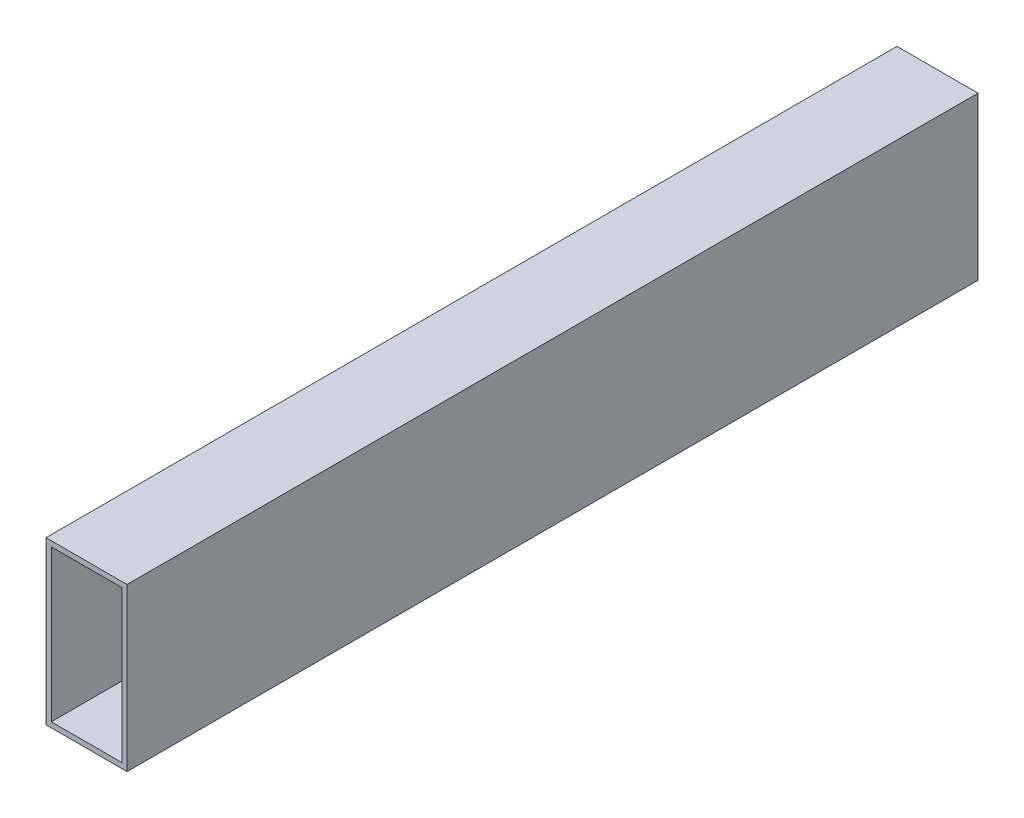
ISO-10303-21;
HEADER;
FILE_DESCRIPTION(('STEP AP214'),'2;1');
FILE_NAME('part.step','',(''),(''),'','','');
FILE_SCHEMA(('AUTOMOTIVE_DESIGN { 1 0 10303 214 1 1 1 1 }'));
ENDSEC;
DATA;
#1=APPLICATION_CONTEXT('core data for automotive mechanical design processes');
#2=APPLICATION_PROTOCOL_DEFINITION('international standard','automotive_design',2000,#1);
#3=PRODUCT_CONTEXT('',#1,'mechanical');
#4=PRODUCT('Part','Part','',(#3));
#5=PRODUCT_RELATED_PRODUCT_CATEGORY('part','',(#4));
#6=PRODUCT_DEFINITION_FORMATION('','',#4);
#7=PRODUCT_DEFINITION_CONTEXT('part definition',#1,'design');
#8=PRODUCT_DEFINITION('design','',#6,#7);
#9=PRODUCT_DEFINITION_SHAPE('','',#8);
#10=(LENGTH_UNIT() NAMED_UNIT(*) SI_UNIT(.MILLI.,.METRE.));
#11=(NAMED_UNIT(*) PLANE_ANGLE_UNIT() SI_UNIT($,.RADIAN.));
#12=(NAMED_UNIT(*) SI_UNIT($,.STERADIAN.) SOLID_ANGLE_UNIT());
#13=UNCERTAINTY_MEASURE_WITH_UNIT(LENGTH_MEASURE(1.E-05),#10,'distance_accuracy_value','');
#14=(GEOMETRIC_REPRESENTATION_CONTEXT(3) GLOBAL_UNCERTAINTY_ASSIGNED_CONTEXT((#13)) GLOBAL_UNIT_ASSIGNED_CONTEXT((#10,
#11,#12)) REPRESENTATION_CONTEXT('',''));
#15=CARTESIAN_POINT('',(0.,0.,0.));
#16=DIRECTION('',(0.,0.,1.));
#17=DIRECTION('',(1.,0.,0.));
#18=AXIS2_PLACEMENT_3D('',#15,#16,#17);
#19=CARTESIAN_POINT('',(-52.8767295597484,-32.8283018867924,266.7));
#20=DIRECTION('',(1.,0.,0.));
#21=DIRECTION('',(0.,0.,-1.));
#22=AXIS2_PLACEMENT_3D('',#19,#20,#21);
#23=PLANE('',#22);
#24=DIRECTION('',(0.,-1.,0.));
#25=VECTOR('',#24,1.);
#26=CARTESIAN_POINT('',(-52.8767295597484,-32.8283018867924,0.));
#27=LINE('',#26,#25);
#28=CARTESIAN_POINT('',(-52.8767295597484,17.9716981132076,0.));
#29=VERTEX_POINT('',#28);
#30=CARTESIAN_POINT('',(-52.8767295597484,-32.8283018867924,0.));
#31=VERTEX_POINT('',#30);
#32=EDGE_CURVE('E132',#29,#31,#27,.T.);
#33=ORIENTED_EDGE('',*,*,#32,.T.);
#34=DIRECTION('',(0.,0.,-1.));
#35=VECTOR('',#34,1.);
#36=CARTESIAN_POINT('',(-52.8767295597484,-32.8283018867924,266.7));
#37=LINE('',#36,#35);
#38=CARTESIAN_POINT('',(-52.8767295597484,-32.8283018867924,266.7));
#39=VERTEX_POINT('',#38);
#40=EDGE_CURVE('E11',#39,#31,#37,.T.);
#41=ORIENTED_EDGE('',*,*,#40,.F.);
#42=DIRECTION('',(0.,-1.,0.));
#43=VECTOR('',#42,1.);
#44=CARTESIAN_POINT('',(-52.8767295597484,-32.8283018867924,266.7));
#45=LINE('',#44,#43);
#46=CARTESIAN_POINT('',(-52.8767295597484,17.9716981132076,266.7));
#47=VERTEX_POINT('',#46);
#48=EDGE_CURVE('E136',#47,#39,#45,.T.);
#49=ORIENTED_EDGE('',*,*,#48,.F.);
#50=DIRECTION('',(0.,0.,-1.));
#51=VECTOR('',#50,1.);
#52=CARTESIAN_POINT('',(-52.8767295597484,17.9716981132076,266.7));
#53=LINE('',#52,#51);
#54=EDGE_CURVE('E146',#47,#29,#53,.T.);
#55=ORIENTED_EDGE('',*,*,#54,.T.);
#56=EDGE_LOOP('',(#33,#41,#49,#55));
#57=FACE_BOUND('',#56,.T.);
#58=ADVANCED_FACE('F35',(#57),#23,.F.);
#59=CARTESIAN_POINT('',(-52.8767295597484,-32.8283018867924,266.7));
#60=DIRECTION('',(0.,1.,0.));
#61=DIRECTION('',(0.,0.,1.));
#62=AXIS2_PLACEMENT_3D('',#59,#60,#61);
#63=PLANE('',#62);
#64=DIRECTION('',(1.,0.,0.));
#65=VECTOR('',#64,1.);
#66=CARTESIAN_POINT('',(-52.8767295597484,-32.8283018867924,0.));
#67=LINE('',#66,#65);
#68=CARTESIAN_POINT('',(-27.4767295597484,-32.8283018867924,0.));
#69=VERTEX_POINT('',#68);
#70=EDGE_CURVE('E149',#31,#69,#67,.T.);
#71=ORIENTED_EDGE('',*,*,#70,.T.);
#72=DIRECTION('',(0.,0.,-1.));
#73=VECTOR('',#72,1.);
#74=CARTESIAN_POINT('',(-27.4767295597484,-32.8283018867924,266.7));
#75=LINE('',#74,#73);
#76=CARTESIAN_POINT('',(-27.4767295597484,-32.8283018867924,266.7));
#77=VERTEX_POINT('',#76);
#78=EDGE_CURVE('E42',#77,#69,#75,.T.);
#79=ORIENTED_EDGE('',*,*,#78,.F.);
#80=DIRECTION('',(1.,0.,0.));
#81=VECTOR('',#80,1.);
#82=CARTESIAN_POINT('',(-52.8767295597484,-32.8283018867924,266.7));
#83=LINE('',#82,#81);
#84=EDGE_CURVE('E139',#39,#77,#83,.T.);
#85=ORIENTED_EDGE('',*,*,#84,.F.);
#86=ORIENTED_EDGE('',*,*,#40,.T.);
#87=EDGE_LOOP('',(#71,#79,#85,#86));
#88=FACE_BOUND('',#87,.T.);
#89=ADVANCED_FACE('F177',(#88),#63,.F.);
#90=CARTESIAN_POINT('',(-27.4767295597484,-32.8283018867924,266.7));
#91=DIRECTION('',(-1.,0.,0.));
#92=DIRECTION('',(0.,0.,1.));
#93=AXIS2_PLACEMENT_3D('',#90,#91,#92);
#94=PLANE('',#93);
#95=DIRECTION('',(0.,1.,0.));
#96=VECTOR('',#95,1.);
#97=CARTESIAN_POINT('',(-27.4767295597484,-32.8283018867924,0.));
#98=LINE('',#97,#96);
#99=CARTESIAN_POINT('',(-27.4767295597484,17.9716981132076,0.));
#100=VERTEX_POINT('',#99);
#101=EDGE_CURVE('E151',#69,#100,#98,.T.);
#102=ORIENTED_EDGE('',*,*,#101,.T.);
#103=DIRECTION('',(0.,0.,-1.));
#104=VECTOR('',#103,1.);
#105=CARTESIAN_POINT('',(-27.4767295597484,17.9716981132076,266.7));
#106=LINE('',#105,#104);
#107=CARTESIAN_POINT('',(-27.4767295597484,17.9716981132076,266.7));
#108=VERTEX_POINT('',#107);
#109=EDGE_CURVE('E156',#108,#100,#106,.T.);
#110=ORIENTED_EDGE('',*,*,#109,.F.);
#111=DIRECTION('',(0.,1.,0.));
#112=VECTOR('',#111,1.);
#113=CARTESIAN_POINT('',(-27.4767295597484,-32.8283018867924,266.7));
#114=LINE('',#113,#112);
#115=EDGE_CURVE('E142',#77,#108,#114,.T.);
#116=ORIENTED_EDGE('',*,*,#115,.F.);
#117=ORIENTED_EDGE('',*,*,#78,.T.);
#118=EDGE_LOOP('',(#102,#110,#116,#117));
#119=FACE_BOUND('',#118,.T.);
#120=ADVANCED_FACE('F163',(#119),#94,.F.);
#121=CARTESIAN_POINT('',(-52.8767295597484,17.9716981132076,266.7));
#122=DIRECTION('',(0.,-1.,0.));
#123=DIRECTION('',(0.,0.,-1.));
#124=AXIS2_PLACEMENT_3D('',#121,#122,#123);
#125=PLANE('',#124);
#126=DIRECTION('',(-1.,0.,0.));
#127=VECTOR('',#126,1.);
#128=CARTESIAN_POINT('',(-52.8767295597484,17.9716981132076,0.));
#129=LINE('',#128,#127);
#130=EDGE_CURVE('E140',#100,#29,#129,.T.);
#131=ORIENTED_EDGE('',*,*,#130,.T.);
#132=ORIENTED_EDGE('',*,*,#54,.F.);
#133=DIRECTION('',(-1.,0.,0.));
#134=VECTOR('',#133,1.);
#135=CARTESIAN_POINT('',(-52.8767295597484,17.9716981132076,266.7));
#136=LINE('',#135,#134);
#137=EDGE_CURVE('E144',#108,#47,#136,.T.);
#138=ORIENTED_EDGE('',*,*,#137,.F.);
#139=ORIENTED_EDGE('',*,*,#109,.T.);
#140=EDGE_LOOP('',(#131,#132,#138,#139));
#141=FACE_BOUND('',#140,.T.);
#142=ADVANCED_FACE('F170',(#141),#125,.F.);
#143=CARTESIAN_POINT('',(0.,0.,266.7));
#144=DIRECTION('',(0.,0.,-1.));
#145=DIRECTION('',(-1.,0.,0.));
#146=AXIS2_PLACEMENT_3D('',#143,#144,#145);
#147=PLANE('',#146);
#148=DIRECTION('',(-1.,0.,0.));
#149=VECTOR('',#148,1.);
#150=CARTESIAN_POINT('',(-51.2257295597484,16.3206981132076,266.7));
#151=LINE('',#150,#149);
#152=CARTESIAN_POINT('',(-29.1277295597484,16.3206981132076,266.7));
#153=VERTEX_POINT('',#152);
#154=CARTESIAN_POINT('',(-51.2257295597484,16.3206981132076,266.7));
#155=VERTEX_POINT('',#154);
#156=EDGE_CURVE('E126',#153,#155,#151,.T.);
#157=ORIENTED_EDGE('',*,*,#156,.F.);
#158=DIRECTION('',(0.,1.,0.));
#159=VECTOR('',#158,1.);
#160=CARTESIAN_POINT('',(-29.1277295597484,16.3206981132076,266.7));
#161=LINE('',#160,#159);
#162=CARTESIAN_POINT('',(-29.1277295597484,-31.1773018867924,266.7));
#163=VERTEX_POINT('',#162);
#164=EDGE_CURVE('E49',#163,#153,#161,.T.);
#165=ORIENTED_EDGE('',*,*,#164,.F.);
#166=DIRECTION('',(1.,0.,0.));
#167=VECTOR('',#166,1.);
#168=CARTESIAN_POINT('',(-51.2257295597484,-31.1773018867924,266.7));
#169=LINE('',#168,#167);
#170=CARTESIAN_POINT('',(-51.2257295597484,-31.1773018867924,266.7));
#171=VERTEX_POINT('',#170);
#172=EDGE_CURVE('E117',#171,#163,#169,.T.);
#173=ORIENTED_EDGE('',*,*,#172,.F.);
#174=DIRECTION('',(0.,-1.,0.));
#175=VECTOR('',#174,1.);
#176=CARTESIAN_POINT('',(-51.2257295597484,16.3206981132076,266.7));
#177=LINE('',#176,#175);
#178=EDGE_CURVE('E120',#155,#171,#177,.T.);
#179=ORIENTED_EDGE('',*,*,#178,.F.);
#180=EDGE_LOOP('',(#157,#165,#173,#179));
#181=FACE_BOUND('',#180,.T.);
#182=ORIENTED_EDGE('',*,*,#48,.T.);
#183=ORIENTED_EDGE('',*,*,#84,.T.);
#184=ORIENTED_EDGE('',*,*,#115,.T.);
#185=ORIENTED_EDGE('',*,*,#137,.T.);
#186=EDGE_LOOP('',(#182,#183,#184,#185));
#187=FACE_BOUND('',#186,.T.);
#188=ADVANCED_FACE('F176',(#181,#187),#147,.F.);
#189=CARTESIAN_POINT('',(0.,0.,0.));
#190=DIRECTION('',(0.,0.,-1.));
#191=DIRECTION('',(-1.,0.,0.));
#192=AXIS2_PLACEMENT_3D('',#189,#190,#191);
#193=PLANE('',#192);
#194=DIRECTION('',(0.,1.,0.));
#195=VECTOR('',#194,1.);
#196=CARTESIAN_POINT('',(-29.1277295597484,16.3206981132076,0.));
#197=LINE('',#196,#195);
#198=CARTESIAN_POINT('',(-29.1277295597484,-31.1773018867924,0.));
#199=VERTEX_POINT('',#198);
#200=CARTESIAN_POINT('',(-29.1277295597484,16.3206981132076,0.));
#201=VERTEX_POINT('',#200);
#202=EDGE_CURVE('E101',#199,#201,#197,.T.);
#203=ORIENTED_EDGE('',*,*,#202,.T.);
#204=DIRECTION('',(-1.,0.,0.));
#205=VECTOR('',#204,1.);
#206=CARTESIAN_POINT('',(-51.2257295597484,16.3206981132076,0.));
#207=LINE('',#206,#205);
#208=CARTESIAN_POINT('',(-51.2257295597484,16.3206981132076,0.));
#209=VERTEX_POINT('',#208);
#210=EDGE_CURVE('E110',#201,#209,#207,.T.);
#211=ORIENTED_EDGE('',*,*,#210,.T.);
#212=DIRECTION('',(0.,-1.,0.));
#213=VECTOR('',#212,1.);
#214=CARTESIAN_POINT('',(-51.2257295597484,16.3206981132076,0.));
#215=LINE('',#214,#213);
#216=CARTESIAN_POINT('',(-51.2257295597484,-31.1773018867924,0.));
#217=VERTEX_POINT('',#216);
#218=EDGE_CURVE('E57',#209,#217,#215,.T.);
#219=ORIENTED_EDGE('',*,*,#218,.T.);
#220=DIRECTION('',(1.,0.,0.));
#221=VECTOR('',#220,1.);
#222=CARTESIAN_POINT('',(-51.2257295597484,-31.1773018867924,0.));
#223=LINE('',#222,#221);
#224=EDGE_CURVE('E107',#217,#199,#223,.T.);
#225=ORIENTED_EDGE('',*,*,#224,.T.);
#226=EDGE_LOOP('',(#203,#211,#219,#225));
#227=FACE_BOUND('',#226,.T.);
#228=ORIENTED_EDGE('',*,*,#32,.F.);
#229=ORIENTED_EDGE('',*,*,#130,.F.);
#230=ORIENTED_EDGE('',*,*,#101,.F.);
#231=ORIENTED_EDGE('',*,*,#70,.F.);
#232=EDGE_LOOP('',(#228,#229,#230,#231));
#233=FACE_BOUND('',#232,.T.);
#234=ADVANCED_FACE('F114',(#227,#233),#193,.T.);
#235=CARTESIAN_POINT('',(-29.1277295597484,16.3206981132076,0.));
#236=DIRECTION('',(1.,0.,0.));
#237=DIRECTION('',(0.,1.,0.));
#238=AXIS2_PLACEMENT_3D('',#235,#236,#237);
#239=PLANE('',#238);
#240=ORIENTED_EDGE('',*,*,#164,.T.);
#241=DIRECTION('',(0.,0.,1.));
#242=VECTOR('',#241,1.);
#243=CARTESIAN_POINT('',(-29.1277295597484,16.3206981132076,0.));
#244=LINE('',#243,#242);
#245=EDGE_CURVE('E97',#201,#153,#244,.T.);
#246=ORIENTED_EDGE('',*,*,#245,.F.);
#247=ORIENTED_EDGE('',*,*,#202,.F.);
#248=DIRECTION('',(0.,0.,1.));
#249=VECTOR('',#248,1.);
#250=CARTESIAN_POINT('',(-29.1277295597484,-31.1773018867924,0.));
#251=LINE('',#250,#249);
#252=EDGE_CURVE('E130',#199,#163,#251,.T.);
#253=ORIENTED_EDGE('',*,*,#252,.T.);
#254=EDGE_LOOP('',(#240,#246,#247,#253));
#255=FACE_BOUND('',#254,.T.);
#256=ADVANCED_FACE('F99',(#255),#239,.F.);
#257=CARTESIAN_POINT('',(-51.2257295597484,-31.1773018867924,0.));
#258=DIRECTION('',(0.,-1.,0.));
#259=DIRECTION('',(0.,0.,-1.));
#260=AXIS2_PLACEMENT_3D('',#257,#258,#259);
#261=PLANE('',#260);
#262=ORIENTED_EDGE('',*,*,#172,.T.);
#263=ORIENTED_EDGE('',*,*,#252,.F.);
#264=ORIENTED_EDGE('',*,*,#224,.F.);
#265=DIRECTION('',(0.,0.,1.));
#266=VECTOR('',#265,1.);
#267=CARTESIAN_POINT('',(-51.2257295597484,-31.1773018867924,0.));
#268=LINE('',#267,#266);
#269=EDGE_CURVE('E133',#217,#171,#268,.T.);
#270=ORIENTED_EDGE('',*,*,#269,.T.);
#271=EDGE_LOOP('',(#262,#263,#264,#270));
#272=FACE_BOUND('',#271,.T.);
#273=ADVANCED_FACE('F194',(#272),#261,.F.);
#274=CARTESIAN_POINT('',(-51.2257295597484,16.3206981132076,0.));
#275=DIRECTION('',(-1.,0.,0.));
#276=DIRECTION('',(0.,-1.,0.));
#277=AXIS2_PLACEMENT_3D('',#274,#275,#276);
#278=PLANE('',#277);
#279=ORIENTED_EDGE('',*,*,#178,.T.);
#280=ORIENTED_EDGE('',*,*,#269,.F.);
#281=ORIENTED_EDGE('',*,*,#218,.F.);
#282=DIRECTION('',(0.,0.,1.));
#283=VECTOR('',#282,1.);
#284=CARTESIAN_POINT('',(-51.2257295597484,16.3206981132076,0.));
#285=LINE('',#284,#283);
#286=EDGE_CURVE('E106',#209,#155,#285,.T.);
#287=ORIENTED_EDGE('',*,*,#286,.T.);
#288=EDGE_LOOP('',(#279,#280,#281,#287));
#289=FACE_BOUND('',#288,.T.);
#290=ADVANCED_FACE('F197',(#289),#278,.F.);
#291=CARTESIAN_POINT('',(-51.2257295597484,16.3206981132076,0.));
#292=DIRECTION('',(0.,1.,0.));
#293=DIRECTION('',(0.,0.,1.));
#294=AXIS2_PLACEMENT_3D('',#291,#292,#293);
#295=PLANE('',#294);
#296=ORIENTED_EDGE('',*,*,#156,.T.);
#297=ORIENTED_EDGE('',*,*,#286,.F.);
#298=ORIENTED_EDGE('',*,*,#210,.F.);
#299=ORIENTED_EDGE('',*,*,#245,.T.);
#300=EDGE_LOOP('',(#296,#297,#298,#299));
#301=FACE_BOUND('',#300,.T.);
#302=ADVANCED_FACE('F111',(#301),#295,.F.);
#303=CLOSED_SHELL('',(#58,#89,#120,#142,#188,#234,#256,#273,#290,#302));
#304=MANIFOLD_SOLID_BREP('B2',#303);
#305=ADVANCED_BREP_SHAPE_REPRESENTATION('',(#18,#304),#14);
#306=SHAPE_DEFINITION_REPRESENTATION(#9,#305);
ENDSEC;
END-ISO-10303-21;
